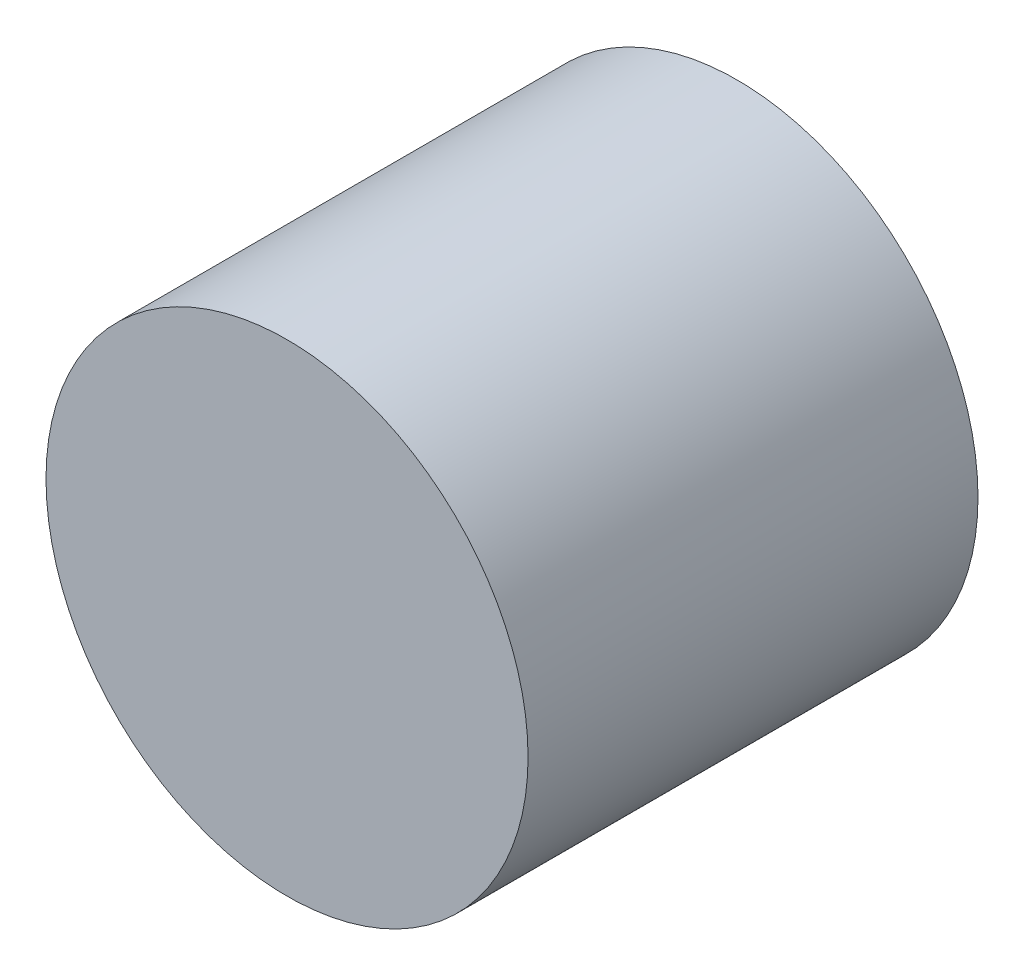
ISO-10303-21;
HEADER;
FILE_DESCRIPTION(('STEP AP214'),'2;1');
FILE_NAME('part.step','',(''),(''),'','','');
FILE_SCHEMA(('AUTOMOTIVE_DESIGN { 1 0 10303 214 1 1 1 1 }'));
ENDSEC;
DATA;
#1=APPLICATION_CONTEXT('core data for automotive mechanical design processes');
#2=APPLICATION_PROTOCOL_DEFINITION('international standard','automotive_design',2000,#1);
#3=PRODUCT_CONTEXT('',#1,'mechanical');
#4=PRODUCT('Part','Part','',(#3));
#5=PRODUCT_RELATED_PRODUCT_CATEGORY('part','',(#4));
#6=PRODUCT_DEFINITION_FORMATION('','',#4);
#7=PRODUCT_DEFINITION_CONTEXT('part definition',#1,'design');
#8=PRODUCT_DEFINITION('design','',#6,#7);
#9=PRODUCT_DEFINITION_SHAPE('','',#8);
#10=(LENGTH_UNIT() NAMED_UNIT(*) SI_UNIT(.MILLI.,.METRE.));
#11=(NAMED_UNIT(*) PLANE_ANGLE_UNIT() SI_UNIT($,.RADIAN.));
#12=(NAMED_UNIT(*) SI_UNIT($,.STERADIAN.) SOLID_ANGLE_UNIT());
#13=UNCERTAINTY_MEASURE_WITH_UNIT(LENGTH_MEASURE(1.E-05),#10,'distance_accuracy_value','');
#14=(GEOMETRIC_REPRESENTATION_CONTEXT(3) GLOBAL_UNCERTAINTY_ASSIGNED_CONTEXT((#13)) GLOBAL_UNIT_ASSIGNED_CONTEXT((#10,
#11,#12)) REPRESENTATION_CONTEXT('',''));
#15=CARTESIAN_POINT('',(0.,0.,0.));
#16=DIRECTION('',(0.,0.,1.));
#17=DIRECTION('',(1.,0.,0.));
#18=AXIS2_PLACEMENT_3D('',#15,#16,#17);
#19=CARTESIAN_POINT('',(0.,0.,14.));
#20=DIRECTION('',(0.,0.,-1.));
#21=DIRECTION('',(-1.,0.,0.));
#22=AXIS2_PLACEMENT_3D('',#19,#20,#21);
#23=CYLINDRICAL_SURFACE('',#22,7.5);
#24=CARTESIAN_POINT('',(0.,0.,14.));
#25=DIRECTION('',(0.,0.,1.));
#26=DIRECTION('',(1.,0.,0.));
#27=AXIS2_PLACEMENT_3D('',#24,#25,#26);
#28=CIRCLE('',#27,7.5);
#29=CARTESIAN_POINT('',(7.5,0.,14.));
#30=VERTEX_POINT('',#29);
#31=EDGE_CURVE('E11',#30,#30,#28,.T.);
#32=ORIENTED_EDGE('',*,*,#31,.F.);
#33=EDGE_LOOP('',(#32));
#34=FACE_BOUND('',#33,.T.);
#35=CARTESIAN_POINT('',(0.,0.,0.));
#36=DIRECTION('',(0.,0.,1.));
#37=DIRECTION('',(1.,0.,0.));
#38=AXIS2_PLACEMENT_3D('',#35,#36,#37);
#39=CIRCLE('',#38,7.5);
#40=CARTESIAN_POINT('',(7.5,0.,0.));
#41=VERTEX_POINT('',#40);
#42=EDGE_CURVE('E36',#41,#41,#39,.T.);
#43=ORIENTED_EDGE('',*,*,#42,.T.);
#44=EDGE_LOOP('',(#43));
#45=FACE_BOUND('',#44,.T.);
#46=ADVANCED_FACE('F33',(#34,#45),#23,.T.);
#47=CARTESIAN_POINT('',(0.,0.,14.));
#48=DIRECTION('',(0.,0.,1.));
#49=DIRECTION('',(1.,0.,0.));
#50=AXIS2_PLACEMENT_3D('',#47,#48,#49);
#51=PLANE('',#50);
#52=ORIENTED_EDGE('',*,*,#31,.T.);
#53=EDGE_LOOP('',(#52));
#54=FACE_BOUND('',#53,.T.);
#55=ADVANCED_FACE('F58',(#54),#51,.T.);
#56=CARTESIAN_POINT('',(0.,0.,0.));
#57=DIRECTION('',(0.,0.,1.));
#58=DIRECTION('',(1.,0.,0.));
#59=AXIS2_PLACEMENT_3D('',#56,#57,#58);
#60=PLANE('',#59);
#61=CARTESIAN_POINT('',(0.,0.,0.));
#62=DIRECTION('',(0.,0.,-1.));
#63=DIRECTION('',(-1.,0.,0.));
#64=AXIS2_PLACEMENT_3D('',#61,#62,#63);
#65=CIRCLE('',#64,3.);
#66=CARTESIAN_POINT('',(-3.,0.,0.));
#67=VERTEX_POINT('',#66);
#68=EDGE_CURVE('E47',#67,#67,#65,.T.);
#69=ORIENTED_EDGE('',*,*,#68,.F.);
#70=EDGE_LOOP('',(#69));
#71=FACE_BOUND('',#70,.T.);
#72=ORIENTED_EDGE('',*,*,#42,.F.);
#73=EDGE_LOOP('',(#72));
#74=FACE_BOUND('',#73,.T.);
#75=ADVANCED_FACE('F54',(#71,#74),#60,.F.);
#76=CARTESIAN_POINT('',(0.,0.,13.8));
#77=DIRECTION('',(0.,0.,1.));
#78=DIRECTION('',(1.,0.,0.));
#79=AXIS2_PLACEMENT_3D('',#76,#77,#78);
#80=PLANE('',#79);
#81=CARTESIAN_POINT('',(0.,0.,13.8));
#82=DIRECTION('',(0.,0.,1.));
#83=DIRECTION('',(1.,0.,0.));
#84=AXIS2_PLACEMENT_3D('',#81,#82,#83);
#85=CIRCLE('',#84,3.);
#86=CARTESIAN_POINT('',(3.,0.,13.8));
#87=VERTEX_POINT('',#86);
#88=EDGE_CURVE('E43',#87,#87,#85,.F.);
#89=ORIENTED_EDGE('',*,*,#88,.T.);
#90=EDGE_LOOP('',(#89));
#91=FACE_BOUND('',#90,.T.);
#92=ADVANCED_FACE('F57',(#91),#80,.F.);
#93=CARTESIAN_POINT('',(0.,0.,22.4852813742386));
#94=DIRECTION('',(0.,0.,-1.));
#95=DIRECTION('',(-1.,0.,0.));
#96=AXIS2_PLACEMENT_3D('',#93,#94,#95);
#97=CYLINDRICAL_SURFACE('',#96,3.);
#98=ORIENTED_EDGE('',*,*,#68,.T.);
#99=EDGE_LOOP('',(#98));
#100=FACE_BOUND('',#99,.T.);
#101=ORIENTED_EDGE('',*,*,#88,.F.);
#102=EDGE_LOOP('',(#101));
#103=FACE_BOUND('',#102,.T.);
#104=ADVANCED_FACE('F51',(#100,#103),#97,.F.);
#105=CLOSED_SHELL('',(#46,#55,#75,#92,#104));
#106=MANIFOLD_SOLID_BREP('B2',#105);
#107=ADVANCED_BREP_SHAPE_REPRESENTATION('',(#18,#106),#14);
#108=SHAPE_DEFINITION_REPRESENTATION(#9,#107);
ENDSEC;
END-ISO-10303-21;
